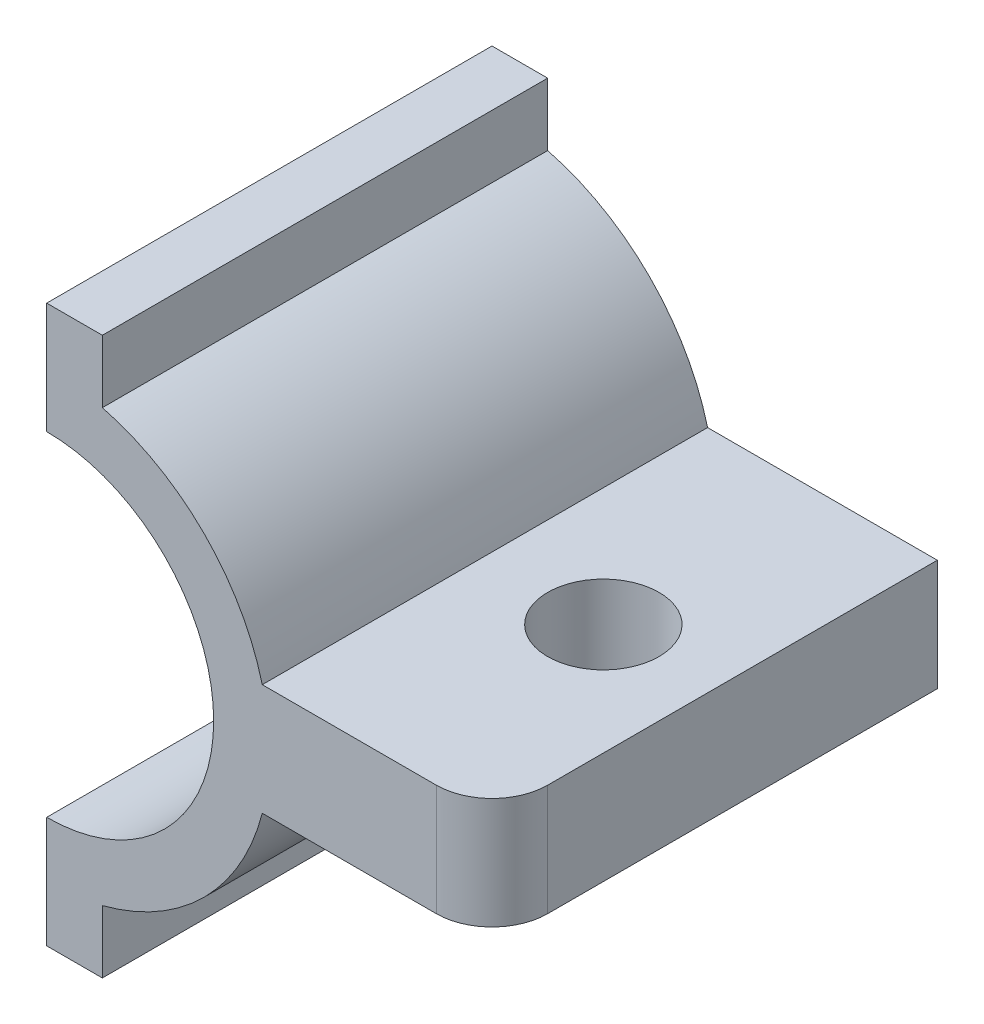
ISO-10303-21;
HEADER;
FILE_DESCRIPTION(('STEP AP214'),'2;1');
FILE_NAME('part.step','',(''),(''),'','','');
FILE_SCHEMA(('AUTOMOTIVE_DESIGN { 1 0 10303 214 1 1 1 1 }'));
ENDSEC;
DATA;
#1=APPLICATION_CONTEXT('core data for automotive mechanical design processes');
#2=APPLICATION_PROTOCOL_DEFINITION('international standard','automotive_design',2000,#1);
#3=PRODUCT_CONTEXT('',#1,'mechanical');
#4=PRODUCT('Part','Part','',(#3));
#5=PRODUCT_RELATED_PRODUCT_CATEGORY('part','',(#4));
#6=PRODUCT_DEFINITION_FORMATION('','',#4);
#7=PRODUCT_DEFINITION_CONTEXT('part definition',#1,'design');
#8=PRODUCT_DEFINITION('design','',#6,#7);
#9=PRODUCT_DEFINITION_SHAPE('','',#8);
#10=(LENGTH_UNIT() NAMED_UNIT(*) SI_UNIT(.MILLI.,.METRE.));
#11=(NAMED_UNIT(*) PLANE_ANGLE_UNIT() SI_UNIT($,.RADIAN.));
#12=(NAMED_UNIT(*) SI_UNIT($,.STERADIAN.) SOLID_ANGLE_UNIT());
#13=UNCERTAINTY_MEASURE_WITH_UNIT(LENGTH_MEASURE(1.E-05),#10,'distance_accuracy_value','');
#14=(GEOMETRIC_REPRESENTATION_CONTEXT(3) GLOBAL_UNCERTAINTY_ASSIGNED_CONTEXT((#13)) GLOBAL_UNIT_ASSIGNED_CONTEXT((#10,
#11,#12)) REPRESENTATION_CONTEXT('',''));
#15=CARTESIAN_POINT('',(0.,0.,0.));
#16=DIRECTION('',(0.,0.,1.));
#17=DIRECTION('',(1.,0.,0.));
#18=AXIS2_PLACEMENT_3D('',#15,#16,#17);
#19=CARTESIAN_POINT('',(0.,0.,80.));
#20=DIRECTION('',(0.,0.,-1.));
#21=DIRECTION('',(-1.,0.,0.));
#22=AXIS2_PLACEMENT_3D('',#19,#20,#21);
#23=CYLINDRICAL_SURFACE('',#22,40.);
#24=CARTESIAN_POINT('',(0.,0.,0.));
#25=DIRECTION('',(0.,0.,1.));
#26=DIRECTION('',(1.,0.,0.));
#27=AXIS2_PLACEMENT_3D('',#24,#25,#26);
#28=CIRCLE('',#27,40.);
#29=CARTESIAN_POINT('',(38.7298334620742,10.,0.));
#30=VERTEX_POINT('',#29);
#31=CARTESIAN_POINT('',(10.,38.7298334620742,0.));
#32=VERTEX_POINT('',#31);
#33=EDGE_CURVE('E150',#30,#32,#28,.T.);
#34=ORIENTED_EDGE('',*,*,#33,.T.);
#35=DIRECTION('',(0.,0.,-1.));
#36=VECTOR('',#35,1.);
#37=CARTESIAN_POINT('',(10.,38.7298334620742,80.));
#38=LINE('',#37,#36);
#39=CARTESIAN_POINT('',(10.,38.7298334620742,80.));
#40=VERTEX_POINT('',#39);
#41=EDGE_CURVE('E130',#40,#32,#38,.T.);
#42=ORIENTED_EDGE('',*,*,#41,.F.);
#43=CARTESIAN_POINT('',(0.,0.,80.));
#44=DIRECTION('',(0.,0.,1.));
#45=DIRECTION('',(1.,0.,0.));
#46=AXIS2_PLACEMENT_3D('',#43,#44,#45);
#47=CIRCLE('',#46,40.);
#48=CARTESIAN_POINT('',(38.7298334620742,10.,80.));
#49=VERTEX_POINT('',#48);
#50=EDGE_CURVE('E137',#49,#40,#47,.T.);
#51=ORIENTED_EDGE('',*,*,#50,.F.);
#52=DIRECTION('',(0.,0.,-1.));
#53=VECTOR('',#52,1.);
#54=CARTESIAN_POINT('',(38.7298334620742,10.,80.));
#55=LINE('',#54,#53);
#56=EDGE_CURVE('E186',#49,#30,#55,.T.);
#57=ORIENTED_EDGE('',*,*,#56,.T.);
#58=EDGE_LOOP('',(#34,#42,#51,#57));
#59=FACE_BOUND('',#58,.T.);
#60=ADVANCED_FACE('F33',(#59),#23,.T.);
#61=CARTESIAN_POINT('',(10.,38.7298334620742,80.));
#62=DIRECTION('',(-1.,0.,0.));
#63=DIRECTION('',(0.,0.,1.));
#64=AXIS2_PLACEMENT_3D('',#61,#62,#63);
#65=PLANE('',#64);
#66=DIRECTION('',(0.,1.,0.));
#67=VECTOR('',#66,1.);
#68=CARTESIAN_POINT('',(10.,38.7298334620742,0.));
#69=LINE('',#68,#67);
#70=CARTESIAN_POINT('',(10.,50.,0.));
#71=VERTEX_POINT('',#70);
#72=EDGE_CURVE('E164',#32,#71,#69,.T.);
#73=ORIENTED_EDGE('',*,*,#72,.T.);
#74=DIRECTION('',(0.,0.,-1.));
#75=VECTOR('',#74,1.);
#76=CARTESIAN_POINT('',(10.,50.,80.));
#77=LINE('',#76,#75);
#78=CARTESIAN_POINT('',(10.,50.,80.));
#79=VERTEX_POINT('',#78);
#80=EDGE_CURVE('E133',#79,#71,#77,.T.);
#81=ORIENTED_EDGE('',*,*,#80,.F.);
#82=DIRECTION('',(0.,1.,0.));
#83=VECTOR('',#82,1.);
#84=CARTESIAN_POINT('',(10.,38.7298334620742,80.));
#85=LINE('',#84,#83);
#86=EDGE_CURVE('E126',#40,#79,#85,.T.);
#87=ORIENTED_EDGE('',*,*,#86,.F.);
#88=ORIENTED_EDGE('',*,*,#41,.T.);
#89=EDGE_LOOP('',(#73,#81,#87,#88));
#90=FACE_BOUND('',#89,.T.);
#91=ADVANCED_FACE('F128',(#90),#65,.F.);
#92=CARTESIAN_POINT('',(0.,50.,80.));
#93=DIRECTION('',(0.,-1.,0.));
#94=DIRECTION('',(0.,0.,-1.));
#95=AXIS2_PLACEMENT_3D('',#92,#93,#94);
#96=PLANE('',#95);
#97=DIRECTION('',(-1.,0.,0.));
#98=VECTOR('',#97,1.);
#99=CARTESIAN_POINT('',(0.,50.,0.));
#100=LINE('',#99,#98);
#101=CARTESIAN_POINT('',(0.,50.,0.));
#102=VERTEX_POINT('',#101);
#103=EDGE_CURVE('E189',#71,#102,#100,.T.);
#104=ORIENTED_EDGE('',*,*,#103,.T.);
#105=DIRECTION('',(0.,0.,-1.));
#106=VECTOR('',#105,1.);
#107=CARTESIAN_POINT('',(0.,50.,80.));
#108=LINE('',#107,#106);
#109=CARTESIAN_POINT('',(0.,50.,80.));
#110=VERTEX_POINT('',#109);
#111=EDGE_CURVE('E154',#110,#102,#108,.T.);
#112=ORIENTED_EDGE('',*,*,#111,.F.);
#113=DIRECTION('',(-1.,0.,0.));
#114=VECTOR('',#113,1.);
#115=CARTESIAN_POINT('',(0.,50.,80.));
#116=LINE('',#115,#114);
#117=EDGE_CURVE('E136',#79,#110,#116,.T.);
#118=ORIENTED_EDGE('',*,*,#117,.F.);
#119=ORIENTED_EDGE('',*,*,#80,.T.);
#120=EDGE_LOOP('',(#104,#112,#118,#119));
#121=FACE_BOUND('',#120,.T.);
#122=ADVANCED_FACE('F256',(#121),#96,.F.);
#123=CARTESIAN_POINT('',(0.,30.,80.));
#124=DIRECTION('',(1.,0.,0.));
#125=DIRECTION('',(0.,1.,0.));
#126=AXIS2_PLACEMENT_3D('',#123,#124,#125);
#127=PLANE('',#126);
#128=DIRECTION('',(0.,-1.,0.));
#129=VECTOR('',#128,1.);
#130=CARTESIAN_POINT('',(0.,30.,0.));
#131=LINE('',#130,#129);
#132=CARTESIAN_POINT('',(0.,30.,0.));
#133=VERTEX_POINT('',#132);
#134=EDGE_CURVE('E191',#102,#133,#131,.T.);
#135=ORIENTED_EDGE('',*,*,#134,.T.);
#136=DIRECTION('',(0.,0.,-1.));
#137=VECTOR('',#136,1.);
#138=CARTESIAN_POINT('',(0.,30.,80.));
#139=LINE('',#138,#137);
#140=CARTESIAN_POINT('',(0.,30.,80.));
#141=VERTEX_POINT('',#140);
#142=EDGE_CURVE('E230',#141,#133,#139,.T.);
#143=ORIENTED_EDGE('',*,*,#142,.F.);
#144=DIRECTION('',(0.,-1.,0.));
#145=VECTOR('',#144,1.);
#146=CARTESIAN_POINT('',(0.,30.,80.));
#147=LINE('',#146,#145);
#148=EDGE_CURVE('E172',#110,#141,#147,.T.);
#149=ORIENTED_EDGE('',*,*,#148,.F.);
#150=ORIENTED_EDGE('',*,*,#111,.T.);
#151=EDGE_LOOP('',(#135,#143,#149,#150));
#152=FACE_BOUND('',#151,.T.);
#153=ADVANCED_FACE('F237',(#152),#127,.F.);
#154=CARTESIAN_POINT('',(0.,0.,80.));
#155=DIRECTION('',(0.,0.,-1.));
#156=DIRECTION('',(-1.,0.,0.));
#157=AXIS2_PLACEMENT_3D('',#154,#155,#156);
#158=CYLINDRICAL_SURFACE('',#157,30.);
#159=CARTESIAN_POINT('',(0.,0.,0.));
#160=DIRECTION('',(0.,0.,-1.));
#161=DIRECTION('',(1.,0.,0.));
#162=AXIS2_PLACEMENT_3D('',#159,#160,#161);
#163=CIRCLE('',#162,30.);
#164=CARTESIAN_POINT('',(0.,-30.,0.));
#165=VERTEX_POINT('',#164);
#166=EDGE_CURVE('E193',#133,#165,#163,.T.);
#167=ORIENTED_EDGE('',*,*,#166,.T.);
#168=DIRECTION('',(0.,0.,-1.));
#169=VECTOR('',#168,1.);
#170=CARTESIAN_POINT('',(0.,-30.,80.));
#171=LINE('',#170,#169);
#172=CARTESIAN_POINT('',(0.,-30.,80.));
#173=VERTEX_POINT('',#172);
#174=EDGE_CURVE('E227',#173,#165,#171,.T.);
#175=ORIENTED_EDGE('',*,*,#174,.F.);
#176=CARTESIAN_POINT('',(0.,0.,80.));
#177=DIRECTION('',(0.,0.,-1.));
#178=DIRECTION('',(1.,0.,0.));
#179=AXIS2_PLACEMENT_3D('',#176,#177,#178);
#180=CIRCLE('',#179,30.);
#181=EDGE_CURVE('E174',#141,#173,#180,.T.);
#182=ORIENTED_EDGE('',*,*,#181,.F.);
#183=ORIENTED_EDGE('',*,*,#142,.T.);
#184=EDGE_LOOP('',(#167,#175,#182,#183));
#185=FACE_BOUND('',#184,.T.);
#186=ADVANCED_FACE('F248',(#185),#158,.F.);
#187=CARTESIAN_POINT('',(0.,-30.,80.));
#188=DIRECTION('',(1.,0.,0.));
#189=DIRECTION('',(0.,1.,0.));
#190=AXIS2_PLACEMENT_3D('',#187,#188,#189);
#191=PLANE('',#190);
#192=DIRECTION('',(0.,-1.,0.));
#193=VECTOR('',#192,1.);
#194=CARTESIAN_POINT('',(0.,-30.,0.));
#195=LINE('',#194,#193);
#196=CARTESIAN_POINT('',(0.,-50.,0.));
#197=VERTEX_POINT('',#196);
#198=EDGE_CURVE('E195',#165,#197,#195,.T.);
#199=ORIENTED_EDGE('',*,*,#198,.T.);
#200=DIRECTION('',(0.,0.,-1.));
#201=VECTOR('',#200,1.);
#202=CARTESIAN_POINT('',(0.,-50.,80.));
#203=LINE('',#202,#201);
#204=CARTESIAN_POINT('',(0.,-50.,80.));
#205=VERTEX_POINT('',#204);
#206=EDGE_CURVE('E224',#205,#197,#203,.T.);
#207=ORIENTED_EDGE('',*,*,#206,.F.);
#208=DIRECTION('',(0.,-1.,0.));
#209=VECTOR('',#208,1.);
#210=CARTESIAN_POINT('',(0.,-30.,80.));
#211=LINE('',#210,#209);
#212=EDGE_CURVE('E176',#173,#205,#211,.T.);
#213=ORIENTED_EDGE('',*,*,#212,.F.);
#214=ORIENTED_EDGE('',*,*,#174,.T.);
#215=EDGE_LOOP('',(#199,#207,#213,#214));
#216=FACE_BOUND('',#215,.T.);
#217=ADVANCED_FACE('F252',(#216),#191,.F.);
#218=CARTESIAN_POINT('',(0.,-50.,80.));
#219=DIRECTION('',(0.,1.,0.));
#220=DIRECTION('',(0.,0.,1.));
#221=AXIS2_PLACEMENT_3D('',#218,#219,#220);
#222=PLANE('',#221);
#223=DIRECTION('',(1.,0.,0.));
#224=VECTOR('',#223,1.);
#225=CARTESIAN_POINT('',(0.,-50.,0.));
#226=LINE('',#225,#224);
#227=CARTESIAN_POINT('',(10.,-50.,0.));
#228=VERTEX_POINT('',#227);
#229=EDGE_CURVE('E197',#197,#228,#226,.T.);
#230=ORIENTED_EDGE('',*,*,#229,.T.);
#231=DIRECTION('',(0.,0.,-1.));
#232=VECTOR('',#231,1.);
#233=CARTESIAN_POINT('',(10.,-50.,80.));
#234=LINE('',#233,#232);
#235=CARTESIAN_POINT('',(10.,-50.,80.));
#236=VERTEX_POINT('',#235);
#237=EDGE_CURVE('E221',#236,#228,#234,.T.);
#238=ORIENTED_EDGE('',*,*,#237,.F.);
#239=DIRECTION('',(1.,0.,0.));
#240=VECTOR('',#239,1.);
#241=CARTESIAN_POINT('',(0.,-50.,80.));
#242=LINE('',#241,#240);
#243=EDGE_CURVE('E178',#205,#236,#242,.T.);
#244=ORIENTED_EDGE('',*,*,#243,.F.);
#245=ORIENTED_EDGE('',*,*,#206,.T.);
#246=EDGE_LOOP('',(#230,#238,#244,#245));
#247=FACE_BOUND('',#246,.T.);
#248=ADVANCED_FACE('F299',(#247),#222,.F.);
#249=CARTESIAN_POINT('',(10.,-38.7298334620742,80.));
#250=DIRECTION('',(-1.,0.,0.));
#251=DIRECTION('',(0.,-1.,0.));
#252=AXIS2_PLACEMENT_3D('',#249,#250,#251);
#253=PLANE('',#252);
#254=DIRECTION('',(0.,1.,0.));
#255=VECTOR('',#254,1.);
#256=CARTESIAN_POINT('',(10.,-38.7298334620742,0.));
#257=LINE('',#256,#255);
#258=CARTESIAN_POINT('',(10.,-38.7298334620742,0.));
#259=VERTEX_POINT('',#258);
#260=EDGE_CURVE('E199',#228,#259,#257,.T.);
#261=ORIENTED_EDGE('',*,*,#260,.T.);
#262=DIRECTION('',(0.,0.,-1.));
#263=VECTOR('',#262,1.);
#264=CARTESIAN_POINT('',(10.,-38.7298334620742,80.));
#265=LINE('',#264,#263);
#266=CARTESIAN_POINT('',(10.,-38.7298334620742,80.));
#267=VERTEX_POINT('',#266);
#268=EDGE_CURVE('E218',#267,#259,#265,.T.);
#269=ORIENTED_EDGE('',*,*,#268,.F.);
#270=DIRECTION('',(0.,1.,0.));
#271=VECTOR('',#270,1.);
#272=CARTESIAN_POINT('',(10.,-38.7298334620742,80.));
#273=LINE('',#272,#271);
#274=EDGE_CURVE('E180',#236,#267,#273,.T.);
#275=ORIENTED_EDGE('',*,*,#274,.F.);
#276=ORIENTED_EDGE('',*,*,#237,.T.);
#277=EDGE_LOOP('',(#261,#269,#275,#276));
#278=FACE_BOUND('',#277,.T.);
#279=ADVANCED_FACE('F308',(#278),#253,.F.);
#280=CARTESIAN_POINT('',(0.,0.,80.));
#281=DIRECTION('',(0.,0.,-1.));
#282=DIRECTION('',(-1.,0.,0.));
#283=AXIS2_PLACEMENT_3D('',#280,#281,#282);
#284=CYLINDRICAL_SURFACE('',#283,40.);
#285=CARTESIAN_POINT('',(0.,0.,0.));
#286=DIRECTION('',(0.,0.,1.));
#287=DIRECTION('',(1.,0.,0.));
#288=AXIS2_PLACEMENT_3D('',#285,#286,#287);
#289=CIRCLE('',#288,40.);
#290=CARTESIAN_POINT('',(38.7298334620742,-10.,0.));
#291=VERTEX_POINT('',#290);
#292=EDGE_CURVE('E201',#259,#291,#289,.T.);
#293=ORIENTED_EDGE('',*,*,#292,.T.);
#294=DIRECTION('',(0.,0.,-1.));
#295=VECTOR('',#294,1.);
#296=CARTESIAN_POINT('',(38.7298334620742,-10.,80.));
#297=LINE('',#296,#295);
#298=CARTESIAN_POINT('',(38.7298334620742,-10.,80.));
#299=VERTEX_POINT('',#298);
#300=EDGE_CURVE('E215',#299,#291,#297,.T.);
#301=ORIENTED_EDGE('',*,*,#300,.F.);
#302=CARTESIAN_POINT('',(0.,0.,80.));
#303=DIRECTION('',(0.,0.,1.));
#304=DIRECTION('',(1.,0.,0.));
#305=AXIS2_PLACEMENT_3D('',#302,#303,#304);
#306=CIRCLE('',#305,40.);
#307=EDGE_CURVE('E182',#267,#299,#306,.T.);
#308=ORIENTED_EDGE('',*,*,#307,.F.);
#309=ORIENTED_EDGE('',*,*,#268,.T.);
#310=EDGE_LOOP('',(#293,#301,#308,#309));
#311=FACE_BOUND('',#310,.T.);
#312=ADVANCED_FACE('F318',(#311),#284,.T.);
#313=CARTESIAN_POINT('',(38.7298334620742,-10.,80.));
#314=DIRECTION('',(0.,1.,0.));
#315=DIRECTION('',(-1.,0.,0.));
#316=AXIS2_PLACEMENT_3D('',#313,#314,#315);
#317=PLANE('',#316);
#318=CARTESIAN_POINT('',(60.,-10.,40.));
#319=DIRECTION('',(0.,-1.,0.));
#320=DIRECTION('',(1.,0.,0.));
#321=AXIS2_PLACEMENT_3D('',#318,#319,#320);
#322=CIRCLE('',#321,9.99999999999999);
#323=CARTESIAN_POINT('',(70.,-10.,40.));
#324=VERTEX_POINT('',#323);
#325=EDGE_CURVE('E160',#324,#324,#322,.T.);
#326=ORIENTED_EDGE('',*,*,#325,.F.);
#327=EDGE_LOOP('',(#326));
#328=FACE_BOUND('',#327,.T.);
#329=DIRECTION('',(0.,0.,-1.));
#330=VECTOR('',#329,1.);
#331=CARTESIAN_POINT('',(80.,-10.,80.));
#332=LINE('',#331,#330);
#333=CARTESIAN_POINT('',(80.,-10.,70.));
#334=VERTEX_POINT('',#333);
#335=CARTESIAN_POINT('',(80.,-10.,0.));
#336=VERTEX_POINT('',#335);
#337=EDGE_CURVE('E213',#334,#336,#332,.T.);
#338=ORIENTED_EDGE('',*,*,#337,.F.);
#339=CARTESIAN_POINT('',(70.,-10.,70.));
#340=DIRECTION('',(0.,1.,0.));
#341=DIRECTION('',(-1.,0.,0.));
#342=AXIS2_PLACEMENT_3D('',#339,#340,#341);
#343=CIRCLE('',#342,10.);
#344=CARTESIAN_POINT('',(70.,-10.,80.));
#345=VERTEX_POINT('',#344);
#346=EDGE_CURVE('E11',#334,#345,#343,.F.);
#347=ORIENTED_EDGE('',*,*,#346,.T.);
#348=DIRECTION('',(1.,0.,0.));
#349=VECTOR('',#348,1.);
#350=CARTESIAN_POINT('',(38.7298334620742,-10.,80.));
#351=LINE('',#350,#349);
#352=EDGE_CURVE('E184',#299,#345,#351,.T.);
#353=ORIENTED_EDGE('',*,*,#352,.F.);
#354=ORIENTED_EDGE('',*,*,#300,.T.);
#355=DIRECTION('',(1.,0.,0.));
#356=VECTOR('',#355,1.);
#357=CARTESIAN_POINT('',(38.7298334620742,-10.,0.));
#358=LINE('',#357,#356);
#359=EDGE_CURVE('E203',#291,#336,#358,.T.);
#360=ORIENTED_EDGE('',*,*,#359,.T.);
#361=EDGE_LOOP('',(#338,#347,#353,#354,#360));
#362=FACE_BOUND('',#361,.T.);
#363=ADVANCED_FACE('F328',(#328,#362),#317,.F.);
#364=CARTESIAN_POINT('',(80.,10.,80.));
#365=DIRECTION('',(-1.,0.,0.));
#366=DIRECTION('',(0.,0.,1.));
#367=AXIS2_PLACEMENT_3D('',#364,#365,#366);
#368=PLANE('',#367);
#369=DIRECTION('',(0.,0.,-1.));
#370=VECTOR('',#369,1.);
#371=CARTESIAN_POINT('',(80.,10.,80.));
#372=LINE('',#371,#370);
#373=CARTESIAN_POINT('',(80.,10.,70.));
#374=VERTEX_POINT('',#373);
#375=CARTESIAN_POINT('',(80.,10.,0.));
#376=VERTEX_POINT('',#375);
#377=EDGE_CURVE('E211',#374,#376,#372,.T.);
#378=ORIENTED_EDGE('',*,*,#377,.F.);
#379=DIRECTION('',(0.,1.,0.));
#380=VECTOR('',#379,1.);
#381=CARTESIAN_POINT('',(80.,-10.,70.));
#382=LINE('',#381,#380);
#383=EDGE_CURVE('E41',#374,#334,#382,.F.);
#384=ORIENTED_EDGE('',*,*,#383,.T.);
#385=ORIENTED_EDGE('',*,*,#337,.T.);
#386=DIRECTION('',(0.,1.,0.));
#387=VECTOR('',#386,1.);
#388=CARTESIAN_POINT('',(80.,10.,0.));
#389=LINE('',#388,#387);
#390=EDGE_CURVE('E206',#336,#376,#389,.T.);
#391=ORIENTED_EDGE('',*,*,#390,.T.);
#392=EDGE_LOOP('',(#378,#384,#385,#391));
#393=FACE_BOUND('',#392,.T.);
#394=ADVANCED_FACE('F359',(#393),#368,.F.);
#395=CARTESIAN_POINT('',(38.7298334620742,10.,80.));
#396=DIRECTION('',(0.,-1.,0.));
#397=DIRECTION('',(1.,0.,0.));
#398=AXIS2_PLACEMENT_3D('',#395,#396,#397);
#399=PLANE('',#398);
#400=CARTESIAN_POINT('',(60.,10.,40.));
#401=DIRECTION('',(0.,-1.,0.));
#402=DIRECTION('',(1.,0.,0.));
#403=AXIS2_PLACEMENT_3D('',#400,#401,#402);
#404=CIRCLE('',#403,9.99999999999999);
#405=CARTESIAN_POINT('',(70.,10.,40.));
#406=VERTEX_POINT('',#405);
#407=EDGE_CURVE('E158',#406,#406,#404,.T.);
#408=ORIENTED_EDGE('',*,*,#407,.T.);
#409=EDGE_LOOP('',(#408));
#410=FACE_BOUND('',#409,.T.);
#411=DIRECTION('',(-1.,0.,0.));
#412=VECTOR('',#411,1.);
#413=CARTESIAN_POINT('',(38.7298334620742,10.,80.));
#414=LINE('',#413,#412);
#415=CARTESIAN_POINT('',(70.,10.,80.));
#416=VERTEX_POINT('',#415);
#417=EDGE_CURVE('E143',#416,#49,#414,.T.);
#418=ORIENTED_EDGE('',*,*,#417,.F.);
#419=CARTESIAN_POINT('',(70.,10.,70.));
#420=DIRECTION('',(0.,-1.,0.));
#421=DIRECTION('',(1.,0.,0.));
#422=AXIS2_PLACEMENT_3D('',#419,#420,#421);
#423=CIRCLE('',#422,10.);
#424=EDGE_CURVE('E55',#416,#374,#423,.F.);
#425=ORIENTED_EDGE('',*,*,#424,.T.);
#426=ORIENTED_EDGE('',*,*,#377,.T.);
#427=DIRECTION('',(-1.,0.,0.));
#428=VECTOR('',#427,1.);
#429=CARTESIAN_POINT('',(38.7298334620742,10.,0.));
#430=LINE('',#429,#428);
#431=EDGE_CURVE('E147',#376,#30,#430,.T.);
#432=ORIENTED_EDGE('',*,*,#431,.T.);
#433=ORIENTED_EDGE('',*,*,#56,.F.);
#434=EDGE_LOOP('',(#418,#425,#426,#432,#433));
#435=FACE_BOUND('',#434,.T.);
#436=ADVANCED_FACE('F369',(#410,#435),#399,.F.);
#437=CARTESIAN_POINT('',(0.,0.,80.));
#438=DIRECTION('',(0.,0.,1.));
#439=DIRECTION('',(1.,0.,0.));
#440=AXIS2_PLACEMENT_3D('',#437,#438,#439);
#441=PLANE('',#440);
#442=ORIENTED_EDGE('',*,*,#352,.T.);
#443=DIRECTION('',(0.,1.,0.));
#444=VECTOR('',#443,1.);
#445=CARTESIAN_POINT('',(70.,10.,80.));
#446=LINE('',#445,#444);
#447=EDGE_CURVE('E151',#345,#416,#446,.T.);
#448=ORIENTED_EDGE('',*,*,#447,.T.);
#449=ORIENTED_EDGE('',*,*,#417,.T.);
#450=ORIENTED_EDGE('',*,*,#50,.T.);
#451=ORIENTED_EDGE('',*,*,#86,.T.);
#452=ORIENTED_EDGE('',*,*,#117,.T.);
#453=ORIENTED_EDGE('',*,*,#148,.T.);
#454=ORIENTED_EDGE('',*,*,#181,.T.);
#455=ORIENTED_EDGE('',*,*,#212,.T.);
#456=ORIENTED_EDGE('',*,*,#243,.T.);
#457=ORIENTED_EDGE('',*,*,#274,.T.);
#458=ORIENTED_EDGE('',*,*,#307,.T.);
#459=EDGE_LOOP('',(#442,#448,#449,#450,#451,#452,#453,#454,#455,#456,#457,#458));
#460=FACE_BOUND('',#459,.T.);
#461=ADVANCED_FACE('F141',(#460),#441,.T.);
#462=CARTESIAN_POINT('',(0.,0.,0.));
#463=DIRECTION('',(0.,0.,1.));
#464=DIRECTION('',(1.,0.,0.));
#465=AXIS2_PLACEMENT_3D('',#462,#463,#464);
#466=PLANE('',#465);
#467=ORIENTED_EDGE('',*,*,#33,.F.);
#468=ORIENTED_EDGE('',*,*,#431,.F.);
#469=ORIENTED_EDGE('',*,*,#390,.F.);
#470=ORIENTED_EDGE('',*,*,#359,.F.);
#471=ORIENTED_EDGE('',*,*,#292,.F.);
#472=ORIENTED_EDGE('',*,*,#260,.F.);
#473=ORIENTED_EDGE('',*,*,#229,.F.);
#474=ORIENTED_EDGE('',*,*,#198,.F.);
#475=ORIENTED_EDGE('',*,*,#166,.F.);
#476=ORIENTED_EDGE('',*,*,#134,.F.);
#477=ORIENTED_EDGE('',*,*,#103,.F.);
#478=ORIENTED_EDGE('',*,*,#72,.F.);
#479=EDGE_LOOP('',(#467,#468,#469,#470,#471,#472,#473,#474,#475,#476,#477,#478));
#480=FACE_BOUND('',#479,.T.);
#481=ADVANCED_FACE('F243',(#480),#466,.F.);
#482=CARTESIAN_POINT('',(60.,50.,40.));
#483=DIRECTION('',(0.,-1.,0.));
#484=DIRECTION('',(1.,0.,0.));
#485=AXIS2_PLACEMENT_3D('',#482,#483,#484);
#486=CYLINDRICAL_SURFACE('',#485,9.99999999999999);
#487=CARTESIAN_POINT('',(70.,-10.,40.));
#488=CARTESIAN_POINT('',(70.,-9.79166666666667,40.));
#489=CARTESIAN_POINT('',(70.,-9.58333333333333,40.));
#490=CARTESIAN_POINT('',(70.,-9.16666666666667,40.));
#491=CARTESIAN_POINT('',(70.,-8.95833333333333,40.));
#492=CARTESIAN_POINT('',(70.,-8.54166666666667,40.));
#493=CARTESIAN_POINT('',(70.,-8.33333333333333,40.));
#494=CARTESIAN_POINT('',(70.,-7.91666666666667,40.));
#495=CARTESIAN_POINT('',(70.,-7.70833333333333,40.));
#496=CARTESIAN_POINT('',(70.,-7.29166666666667,40.));
#497=CARTESIAN_POINT('',(70.,-7.08333333333333,40.));
#498=CARTESIAN_POINT('',(70.,-6.66666666666667,40.));
#499=CARTESIAN_POINT('',(70.,-6.45833333333333,40.));
#500=CARTESIAN_POINT('',(70.,-6.04166666666667,40.));
#501=CARTESIAN_POINT('',(70.,-5.83333333333333,40.));
#502=CARTESIAN_POINT('',(70.,-5.41666666666666,40.));
#503=CARTESIAN_POINT('',(70.,-5.20833333333333,40.));
#504=CARTESIAN_POINT('',(70.,-4.79166666666666,40.));
#505=CARTESIAN_POINT('',(70.,-4.58333333333333,40.));
#506=CARTESIAN_POINT('',(70.,-4.16666666666667,40.));
#507=CARTESIAN_POINT('',(70.,-3.95833333333333,40.));
#508=CARTESIAN_POINT('',(70.,-3.54166666666667,40.));
#509=CARTESIAN_POINT('',(70.,-3.33333333333334,40.));
#510=CARTESIAN_POINT('',(70.,-2.91666666666667,40.));
#511=CARTESIAN_POINT('',(70.,-2.70833333333334,40.));
#512=CARTESIAN_POINT('',(70.,-2.29166666666667,40.));
#513=CARTESIAN_POINT('',(70.,-2.08333333333334,40.));
#514=CARTESIAN_POINT('',(70.,-1.66666666666667,40.));
#515=CARTESIAN_POINT('',(70.,-1.45833333333333,40.));
#516=CARTESIAN_POINT('',(70.,-1.04166666666667,40.));
#517=CARTESIAN_POINT('',(70.,-0.833333333333334,40.));
#518=CARTESIAN_POINT('',(70.,-0.416666666666667,40.));
#519=CARTESIAN_POINT('',(70.,-0.208333333333333,40.));
#520=CARTESIAN_POINT('',(70.,0.208333333333333,40.));
#521=CARTESIAN_POINT('',(70.,0.416666666666667,40.));
#522=CARTESIAN_POINT('',(70.,0.833333333333334,40.));
#523=CARTESIAN_POINT('',(70.,1.04166666666667,40.));
#524=CARTESIAN_POINT('',(70.,1.45833333333333,40.));
#525=CARTESIAN_POINT('',(70.,1.66666666666667,40.));
#526=CARTESIAN_POINT('',(70.,2.08333333333334,40.));
#527=CARTESIAN_POINT('',(70.,2.29166666666667,40.));
#528=CARTESIAN_POINT('',(70.,2.70833333333334,40.));
#529=CARTESIAN_POINT('',(70.,2.91666666666667,40.));
#530=CARTESIAN_POINT('',(70.,3.33333333333333,40.));
#531=CARTESIAN_POINT('',(70.,3.54166666666667,40.));
#532=CARTESIAN_POINT('',(70.,3.95833333333333,40.));
#533=CARTESIAN_POINT('',(70.,4.16666666666666,40.));
#534=CARTESIAN_POINT('',(70.,4.58333333333333,40.));
#535=CARTESIAN_POINT('',(70.,4.79166666666666,40.));
#536=CARTESIAN_POINT('',(70.,5.20833333333333,40.));
#537=CARTESIAN_POINT('',(70.,5.41666666666666,40.));
#538=CARTESIAN_POINT('',(70.,5.83333333333333,40.));
#539=CARTESIAN_POINT('',(70.,6.04166666666667,40.));
#540=CARTESIAN_POINT('',(70.,6.45833333333333,40.));
#541=CARTESIAN_POINT('',(70.,6.66666666666667,40.));
#542=CARTESIAN_POINT('',(70.,7.08333333333333,40.));
#543=CARTESIAN_POINT('',(70.,7.29166666666667,40.));
#544=CARTESIAN_POINT('',(70.,7.70833333333333,40.));
#545=CARTESIAN_POINT('',(70.,7.91666666666667,40.));
#546=CARTESIAN_POINT('',(70.,8.33333333333333,40.));
#547=CARTESIAN_POINT('',(70.,8.54166666666667,40.));
#548=CARTESIAN_POINT('',(70.,8.95833333333333,40.));
#549=CARTESIAN_POINT('',(70.,9.16666666666667,40.));
#550=CARTESIAN_POINT('',(70.,9.58333333333333,40.));
#551=CARTESIAN_POINT('',(70.,9.79166666666667,40.));
#552=CARTESIAN_POINT('',(70.,10.,40.));
#553=B_SPLINE_CURVE_WITH_KNOTS('',3,(#487,#488,#489,#490,#491,#492,#493,#494,#495,#496,#497,
#498,#499,#500,#501,#502,#503,#504,#505,#506,#507,#508,#509,#510,#511,#512,#513,#514,#515,#516,
#517,#518,#519,#520,#521,#522,#523,#524,#525,#526,#527,#528,#529,#530,#531,#532,#533,#534,#535,
#536,#537,#538,#539,#540,#541,#542,#543,#544,#545,#546,#547,#548,#549,#550,#551,#552),
.UNSPECIFIED.,.F.,.F.,(4,2,2,2,2,2,2,2,2,2,2,2,2,2,2,2,2,2,2,2,2,2,2,2,2,2,2,2,2,2,2,2,4),(0.,
0.625000000000001,1.25,1.875,2.5,3.125,3.75,4.375,5.,5.62500000000001,6.25,6.875,7.5,8.125,8.75,
9.375,10.,10.625,11.25,11.875,12.5,13.125,13.75,14.375,15.,15.625,16.25,16.875,17.5,18.125,
18.75,19.375,20.),.UNSPECIFIED.);
#554=EDGE_CURVE('BSEAM340',#324,#406,#553,.T.);
#555=ORIENTED_EDGE('',*,*,#325,.T.);
#556=ORIENTED_EDGE('',*,*,#407,.F.);
#557=ORIENTED_EDGE('',*,*,#554,.T.);
#558=ORIENTED_EDGE('',*,*,#554,.F.);
#559=EDGE_LOOP('',(#555,#557,#556,#558));
#560=FACE_BOUND('',#559,.T.);
#561=ADVANCED_FACE('F340',(#560),#486,.F.);
#562=CARTESIAN_POINT('',(70.,0.,70.));
#563=DIRECTION('',(0.,-1.,0.));
#564=DIRECTION('',(0.,0.,-1.));
#565=AXIS2_PLACEMENT_3D('',#562,#563,#564);
#566=CYLINDRICAL_SURFACE('',#565,10.);
#567=ORIENTED_EDGE('',*,*,#346,.F.);
#568=ORIENTED_EDGE('',*,*,#383,.F.);
#569=ORIENTED_EDGE('',*,*,#424,.F.);
#570=ORIENTED_EDGE('',*,*,#447,.F.);
#571=EDGE_LOOP('',(#567,#568,#569,#570));
#572=FACE_BOUND('',#571,.T.);
#573=ADVANCED_FACE('F35',(#572),#566,.T.);
#574=CLOSED_SHELL('',(#60,#91,#122,#153,#186,#217,#248,#279,#312,#363,#394,#436,#461,#481,#561,#573));
#575=MANIFOLD_SOLID_BREP('B2',#574);
#576=ADVANCED_BREP_SHAPE_REPRESENTATION('',(#18,#575),#14);
#577=SHAPE_DEFINITION_REPRESENTATION(#9,#576);
ENDSEC;
END-ISO-10303-21;
